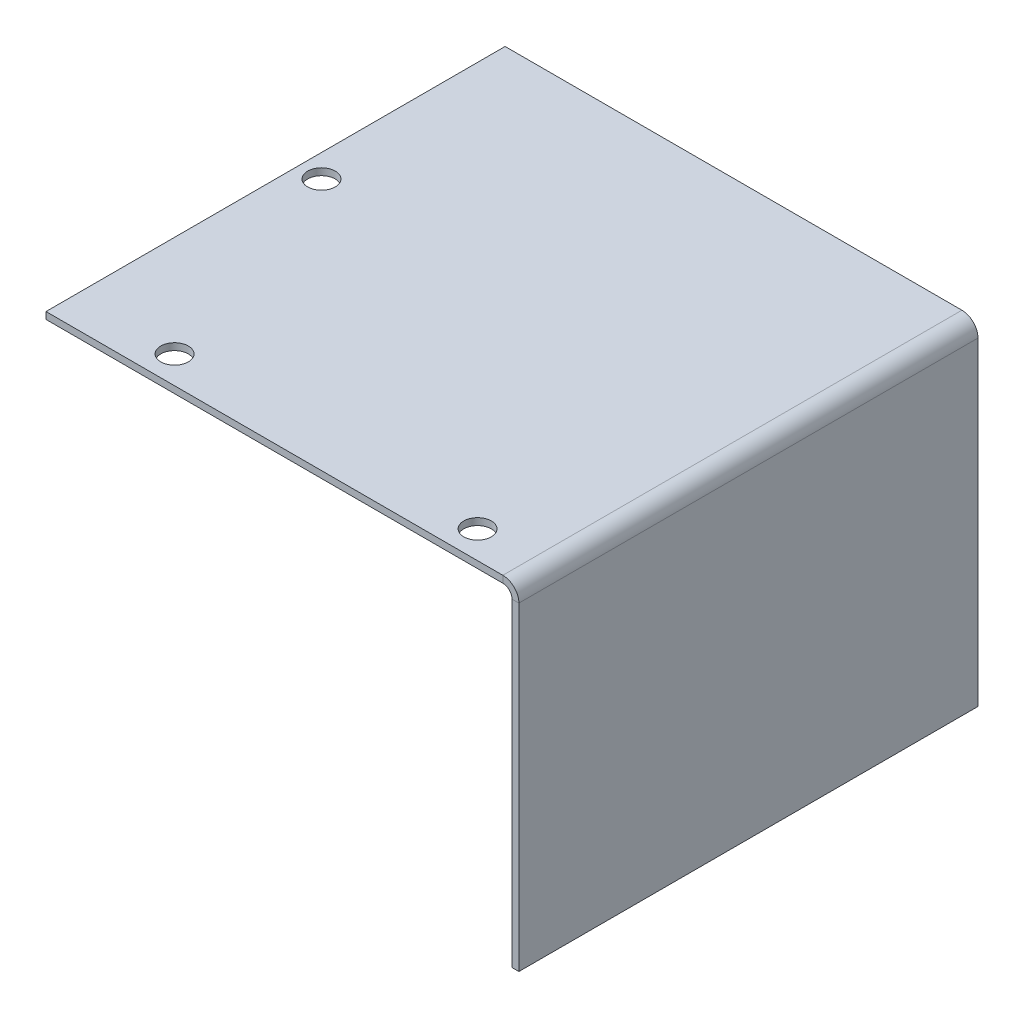
ISO-10303-21;
HEADER;
FILE_DESCRIPTION(('STEP AP214'),'2;1');
FILE_NAME('part.step','',(''),(''),'','','');
FILE_SCHEMA(('AUTOMOTIVE_DESIGN { 1 0 10303 214 1 1 1 1 }'));
ENDSEC;
DATA;
#1=APPLICATION_CONTEXT('core data for automotive mechanical design processes');
#2=APPLICATION_PROTOCOL_DEFINITION('international standard','automotive_design',2000,#1);
#3=PRODUCT_CONTEXT('',#1,'mechanical');
#4=PRODUCT('Part','Part','',(#3));
#5=PRODUCT_RELATED_PRODUCT_CATEGORY('part','',(#4));
#6=PRODUCT_DEFINITION_FORMATION('','',#4);
#7=PRODUCT_DEFINITION_CONTEXT('part definition',#1,'design');
#8=PRODUCT_DEFINITION('design','',#6,#7);
#9=PRODUCT_DEFINITION_SHAPE('','',#8);
#10=(LENGTH_UNIT() NAMED_UNIT(*) SI_UNIT(.MILLI.,.METRE.));
#11=(NAMED_UNIT(*) PLANE_ANGLE_UNIT() SI_UNIT($,.RADIAN.));
#12=(NAMED_UNIT(*) SI_UNIT($,.STERADIAN.) SOLID_ANGLE_UNIT());
#13=UNCERTAINTY_MEASURE_WITH_UNIT(LENGTH_MEASURE(1.E-05),#10,'distance_accuracy_value','');
#14=(GEOMETRIC_REPRESENTATION_CONTEXT(3) GLOBAL_UNCERTAINTY_ASSIGNED_CONTEXT((#13)) GLOBAL_UNIT_ASSIGNED_CONTEXT((#10,
#11,#12)) REPRESENTATION_CONTEXT('',''));
#15=CARTESIAN_POINT('',(0.,0.,0.));
#16=DIRECTION('',(0.,0.,1.));
#17=DIRECTION('',(1.,0.,0.));
#18=AXIS2_PLACEMENT_3D('',#15,#16,#17);
#19=CARTESIAN_POINT('',(103.,-3.5,100.));
#20=DIRECTION('',(0.,0.,1.));
#21=DIRECTION('',(1.,0.,0.));
#22=AXIS2_PLACEMENT_3D('',#19,#20,#21);
#23=PLANE('',#22);
#24=DIRECTION('',(-1.,0.,0.));
#25=VECTOR('',#24,1.);
#26=CARTESIAN_POINT('',(103.,-3.5,100.));
#27=LINE('',#26,#25);
#28=CARTESIAN_POINT('',(103.,-3.5,100.));
#29=VERTEX_POINT('',#28);
#30=CARTESIAN_POINT('',(101.5,-3.5,100.));
#31=VERTEX_POINT('',#30);
#32=EDGE_CURVE('E11',#29,#31,#27,.T.);
#33=ORIENTED_EDGE('',*,*,#32,.F.);
#34=CARTESIAN_POINT('',(99.5,-3.5,100.));
#35=DIRECTION('',(0.,0.,1.));
#36=DIRECTION('',(1.,0.,0.));
#37=AXIS2_PLACEMENT_3D('',#34,#35,#36);
#38=CIRCLE('',#37,3.5);
#39=CARTESIAN_POINT('',(99.5,0.,100.));
#40=VERTEX_POINT('',#39);
#41=EDGE_CURVE('E134',#40,#29,#38,.F.);
#42=ORIENTED_EDGE('',*,*,#41,.F.);
#43=DIRECTION('',(0.,1.,0.));
#44=VECTOR('',#43,1.);
#45=CARTESIAN_POINT('',(99.5,-1.5,100.));
#46=LINE('',#45,#44);
#47=CARTESIAN_POINT('',(99.5,-1.5,100.));
#48=VERTEX_POINT('',#47);
#49=EDGE_CURVE('E44',#48,#40,#46,.T.);
#50=ORIENTED_EDGE('',*,*,#49,.F.);
#51=CARTESIAN_POINT('',(99.5,-3.5,100.));
#52=DIRECTION('',(0.,0.,1.));
#53=DIRECTION('',(1.,0.,0.));
#54=AXIS2_PLACEMENT_3D('',#51,#52,#53);
#55=CIRCLE('',#54,2.);
#56=EDGE_CURVE('E127',#48,#31,#55,.F.);
#57=ORIENTED_EDGE('',*,*,#56,.T.);
#58=EDGE_LOOP('',(#33,#42,#50,#57));
#59=FACE_BOUND('',#58,.T.);
#60=ADVANCED_FACE('F35',(#59),#23,.T.);
#61=CARTESIAN_POINT('',(99.5,-1.5,100.));
#62=DIRECTION('',(0.,0.,1.));
#63=DIRECTION('',(1.,0.,0.));
#64=AXIS2_PLACEMENT_3D('',#61,#62,#63);
#65=PLANE('',#64);
#66=DIRECTION('',(0.,-1.,0.));
#67=VECTOR('',#66,1.);
#68=CARTESIAN_POINT('',(103.,0.,100.));
#69=LINE('',#68,#67);
#70=CARTESIAN_POINT('',(103.,-73.,100.));
#71=VERTEX_POINT('',#70);
#72=EDGE_CURVE('E197',#29,#71,#69,.T.);
#73=ORIENTED_EDGE('',*,*,#72,.F.);
#74=ORIENTED_EDGE('',*,*,#32,.T.);
#75=DIRECTION('',(0.,-1.,0.));
#76=VECTOR('',#75,1.);
#77=CARTESIAN_POINT('',(101.5,0.,100.));
#78=LINE('',#77,#76);
#79=CARTESIAN_POINT('',(101.5,-73.,100.));
#80=VERTEX_POINT('',#79);
#81=EDGE_CURVE('E93',#31,#80,#78,.T.);
#82=ORIENTED_EDGE('',*,*,#81,.T.);
#83=DIRECTION('',(-1.,0.,0.));
#84=VECTOR('',#83,1.);
#85=CARTESIAN_POINT('',(103.,-73.,100.));
#86=LINE('',#85,#84);
#87=EDGE_CURVE('E194',#71,#80,#86,.T.);
#88=ORIENTED_EDGE('',*,*,#87,.F.);
#89=EDGE_LOOP('',(#73,#74,#82,#88));
#90=FACE_BOUND('',#89,.T.);
#91=ADVANCED_FACE('F217',(#90),#65,.T.);
#92=CARTESIAN_POINT('',(99.5,0.,0.));
#93=DIRECTION('',(0.,0.,-1.));
#94=DIRECTION('',(-1.,0.,0.));
#95=AXIS2_PLACEMENT_3D('',#92,#93,#94);
#96=PLANE('',#95);
#97=DIRECTION('',(0.,-1.,0.));
#98=VECTOR('',#97,1.);
#99=CARTESIAN_POINT('',(99.5,0.,0.));
#100=LINE('',#99,#98);
#101=CARTESIAN_POINT('',(99.5,0.,0.));
#102=VERTEX_POINT('',#101);
#103=CARTESIAN_POINT('',(99.5,-1.5,0.));
#104=VERTEX_POINT('',#103);
#105=EDGE_CURVE('E80',#102,#104,#100,.T.);
#106=ORIENTED_EDGE('',*,*,#105,.F.);
#107=CARTESIAN_POINT('',(99.5,-3.5,0.));
#108=DIRECTION('',(0.,0.,1.));
#109=DIRECTION('',(1.,0.,0.));
#110=AXIS2_PLACEMENT_3D('',#107,#108,#109);
#111=CIRCLE('',#110,3.5);
#112=CARTESIAN_POINT('',(103.,-3.5,0.));
#113=VERTEX_POINT('',#112);
#114=EDGE_CURVE('E150',#102,#113,#111,.F.);
#115=ORIENTED_EDGE('',*,*,#114,.T.);
#116=DIRECTION('',(1.,0.,0.));
#117=VECTOR('',#116,1.);
#118=CARTESIAN_POINT('',(101.5,-3.5,0.));
#119=LINE('',#118,#117);
#120=CARTESIAN_POINT('',(101.5,-3.5,0.));
#121=VERTEX_POINT('',#120);
#122=EDGE_CURVE('E87',#121,#113,#119,.T.);
#123=ORIENTED_EDGE('',*,*,#122,.F.);
#124=CARTESIAN_POINT('',(99.5,-3.5,0.));
#125=DIRECTION('',(0.,0.,1.));
#126=DIRECTION('',(1.,0.,0.));
#127=AXIS2_PLACEMENT_3D('',#124,#125,#126);
#128=CIRCLE('',#127,2.);
#129=EDGE_CURVE('E157',#104,#121,#128,.F.);
#130=ORIENTED_EDGE('',*,*,#129,.F.);
#131=EDGE_LOOP('',(#106,#115,#123,#130));
#132=FACE_BOUND('',#131,.T.);
#133=ADVANCED_FACE('F215',(#132),#96,.T.);
#134=CARTESIAN_POINT('',(101.5,-3.5,0.));
#135=DIRECTION('',(0.,0.,-1.));
#136=DIRECTION('',(-1.,0.,0.));
#137=AXIS2_PLACEMENT_3D('',#134,#135,#136);
#138=PLANE('',#137);
#139=DIRECTION('',(1.,0.,0.));
#140=VECTOR('',#139,1.);
#141=CARTESIAN_POINT('',(0.,0.,0.));
#142=LINE('',#141,#140);
#143=CARTESIAN_POINT('',(0.,0.,0.));
#144=VERTEX_POINT('',#143);
#145=EDGE_CURVE('E152',#144,#102,#142,.T.);
#146=ORIENTED_EDGE('',*,*,#145,.T.);
#147=ORIENTED_EDGE('',*,*,#105,.T.);
#148=DIRECTION('',(1.,0.,0.));
#149=VECTOR('',#148,1.);
#150=CARTESIAN_POINT('',(0.,-1.5,0.));
#151=LINE('',#150,#149);
#152=CARTESIAN_POINT('',(0.,-1.5,0.));
#153=VERTEX_POINT('',#152);
#154=EDGE_CURVE('E155',#153,#104,#151,.T.);
#155=ORIENTED_EDGE('',*,*,#154,.F.);
#156=DIRECTION('',(0.,1.,0.));
#157=VECTOR('',#156,1.);
#158=CARTESIAN_POINT('',(0.,-1.5,0.));
#159=LINE('',#158,#157);
#160=EDGE_CURVE('E115',#153,#144,#159,.T.);
#161=ORIENTED_EDGE('',*,*,#160,.T.);
#162=EDGE_LOOP('',(#146,#147,#155,#161));
#163=FACE_BOUND('',#162,.T.);
#164=ADVANCED_FACE('F211',(#163),#138,.T.);
#165=CARTESIAN_POINT('',(101.5,0.,100.));
#166=DIRECTION('',(1.,0.,0.));
#167=DIRECTION('',(0.,1.,0.));
#168=AXIS2_PLACEMENT_3D('',#165,#166,#167);
#169=PLANE('',#168);
#170=DIRECTION('',(0.,-1.,0.));
#171=VECTOR('',#170,1.);
#172=CARTESIAN_POINT('',(101.5,0.,0.));
#173=LINE('',#172,#171);
#174=CARTESIAN_POINT('',(101.5,-73.,0.));
#175=VERTEX_POINT('',#174);
#176=EDGE_CURVE('E140',#121,#175,#173,.T.);
#177=ORIENTED_EDGE('',*,*,#176,.T.);
#178=DIRECTION('',(0.,0.,-1.));
#179=VECTOR('',#178,1.);
#180=CARTESIAN_POINT('',(101.5,-73.,100.));
#181=LINE('',#180,#179);
#182=EDGE_CURVE('E171',#80,#175,#181,.T.);
#183=ORIENTED_EDGE('',*,*,#182,.F.);
#184=ORIENTED_EDGE('',*,*,#81,.F.);
#185=DIRECTION('',(0.,0.,-1.));
#186=VECTOR('',#185,1.);
#187=CARTESIAN_POINT('',(101.5,-3.5,100.));
#188=LINE('',#187,#186);
#189=EDGE_CURVE('E139',#31,#121,#188,.T.);
#190=ORIENTED_EDGE('',*,*,#189,.T.);
#191=EDGE_LOOP('',(#177,#183,#184,#190));
#192=FACE_BOUND('',#191,.T.);
#193=ADVANCED_FACE('F223',(#192),#169,.F.);
#194=CARTESIAN_POINT('',(103.,-73.,100.));
#195=DIRECTION('',(0.,-1.,0.));
#196=DIRECTION('',(0.,0.,-1.));
#197=AXIS2_PLACEMENT_3D('',#194,#195,#196);
#198=PLANE('',#197);
#199=DIRECTION('',(-1.,0.,0.));
#200=VECTOR('',#199,1.);
#201=CARTESIAN_POINT('',(103.,-73.,0.));
#202=LINE('',#201,#200);
#203=CARTESIAN_POINT('',(103.,-73.,0.));
#204=VERTEX_POINT('',#203);
#205=EDGE_CURVE('E143',#204,#175,#202,.T.);
#206=ORIENTED_EDGE('',*,*,#205,.F.);
#207=DIRECTION('',(0.,0.,-1.));
#208=VECTOR('',#207,1.);
#209=CARTESIAN_POINT('',(103.,-73.,100.));
#210=LINE('',#209,#208);
#211=EDGE_CURVE('E169',#71,#204,#210,.T.);
#212=ORIENTED_EDGE('',*,*,#211,.F.);
#213=ORIENTED_EDGE('',*,*,#87,.T.);
#214=ORIENTED_EDGE('',*,*,#182,.T.);
#215=EDGE_LOOP('',(#206,#212,#213,#214));
#216=FACE_BOUND('',#215,.T.);
#217=ADVANCED_FACE('F254',(#216),#198,.T.);
#218=CARTESIAN_POINT('',(103.,0.,100.));
#219=DIRECTION('',(1.,0.,0.));
#220=DIRECTION('',(0.,1.,0.));
#221=AXIS2_PLACEMENT_3D('',#218,#219,#220);
#222=PLANE('',#221);
#223=DIRECTION('',(0.,-1.,0.));
#224=VECTOR('',#223,1.);
#225=CARTESIAN_POINT('',(103.,0.,0.));
#226=LINE('',#225,#224);
#227=EDGE_CURVE('E147',#113,#204,#226,.T.);
#228=ORIENTED_EDGE('',*,*,#227,.F.);
#229=DIRECTION('',(0.,0.,-1.));
#230=VECTOR('',#229,1.);
#231=CARTESIAN_POINT('',(103.,-3.5,100.));
#232=LINE('',#231,#230);
#233=EDGE_CURVE('E166',#29,#113,#232,.T.);
#234=ORIENTED_EDGE('',*,*,#233,.F.);
#235=ORIENTED_EDGE('',*,*,#72,.T.);
#236=ORIENTED_EDGE('',*,*,#211,.T.);
#237=EDGE_LOOP('',(#228,#234,#235,#236));
#238=FACE_BOUND('',#237,.T.);
#239=ADVANCED_FACE('F265',(#238),#222,.T.);
#240=CARTESIAN_POINT('',(99.5,-3.5,100.));
#241=DIRECTION('',(0.,0.,-1.));
#242=DIRECTION('',(-1.,0.,0.));
#243=AXIS2_PLACEMENT_3D('',#240,#241,#242);
#244=CYLINDRICAL_SURFACE('',#243,3.5);
#245=ORIENTED_EDGE('',*,*,#114,.F.);
#246=DIRECTION('',(0.,0.,-1.));
#247=VECTOR('',#246,1.);
#248=CARTESIAN_POINT('',(99.5,0.,100.));
#249=LINE('',#248,#247);
#250=EDGE_CURVE('E163',#40,#102,#249,.T.);
#251=ORIENTED_EDGE('',*,*,#250,.F.);
#252=ORIENTED_EDGE('',*,*,#41,.T.);
#253=ORIENTED_EDGE('',*,*,#233,.T.);
#254=EDGE_LOOP('',(#245,#251,#252,#253));
#255=FACE_BOUND('',#254,.T.);
#256=ADVANCED_FACE('F204',(#255),#244,.T.);
#257=CARTESIAN_POINT('',(0.,0.,100.));
#258=DIRECTION('',(0.,1.,0.));
#259=DIRECTION('',(0.,0.,1.));
#260=AXIS2_PLACEMENT_3D('',#257,#258,#259);
#261=PLANE('',#260);
#262=CARTESIAN_POINT('',(4.99999999999991,0.,45.0000000000002));
#263=DIRECTION('',(0.,1.,0.));
#264=DIRECTION('',(0.,0.,1.));
#265=AXIS2_PLACEMENT_3D('',#262,#263,#264);
#266=CIRCLE('',#265,3.);
#267=CARTESIAN_POINT('',(4.99999999999991,0.,48.0000000000002));
#268=VERTEX_POINT('',#267);
#269=EDGE_CURVE('E190',#268,#268,#266,.T.);
#270=ORIENTED_EDGE('',*,*,#269,.F.);
#271=EDGE_LOOP('',(#270));
#272=FACE_BOUND('',#271,.T.);
#273=CARTESIAN_POINT('',(88.,0.,93.9999999999999));
#274=DIRECTION('',(0.,1.,0.));
#275=DIRECTION('',(0.,0.,1.));
#276=AXIS2_PLACEMENT_3D('',#273,#274,#275);
#277=CIRCLE('',#276,3.00000000000001);
#278=CARTESIAN_POINT('',(88.,0.,96.9999999999999));
#279=VERTEX_POINT('',#278);
#280=EDGE_CURVE('E180',#279,#279,#277,.T.);
#281=ORIENTED_EDGE('',*,*,#280,.F.);
#282=EDGE_LOOP('',(#281));
#283=FACE_BOUND('',#282,.T.);
#284=CARTESIAN_POINT('',(21.9999999999998,0.,93.9999999999999));
#285=DIRECTION('',(0.,1.,0.));
#286=DIRECTION('',(0.,0.,1.));
#287=AXIS2_PLACEMENT_3D('',#284,#285,#286);
#288=CIRCLE('',#287,3.);
#289=CARTESIAN_POINT('',(21.9999999999998,0.,96.9999999999999));
#290=VERTEX_POINT('',#289);
#291=EDGE_CURVE('E177',#290,#290,#288,.T.);
#292=ORIENTED_EDGE('',*,*,#291,.F.);
#293=EDGE_LOOP('',(#292));
#294=FACE_BOUND('',#293,.T.);
#295=ORIENTED_EDGE('',*,*,#145,.F.);
#296=DIRECTION('',(0.,0.,-1.));
#297=VECTOR('',#296,1.);
#298=CARTESIAN_POINT('',(0.,0.,100.));
#299=LINE('',#298,#297);
#300=CARTESIAN_POINT('',(0.,0.,100.));
#301=VERTEX_POINT('',#300);
#302=EDGE_CURVE('E117',#301,#144,#299,.T.);
#303=ORIENTED_EDGE('',*,*,#302,.F.);
#304=DIRECTION('',(1.,0.,0.));
#305=VECTOR('',#304,1.);
#306=CARTESIAN_POINT('',(0.,0.,100.));
#307=LINE('',#306,#305);
#308=EDGE_CURVE('E132',#301,#40,#307,.T.);
#309=ORIENTED_EDGE('',*,*,#308,.T.);
#310=ORIENTED_EDGE('',*,*,#250,.T.);
#311=EDGE_LOOP('',(#295,#303,#309,#310));
#312=FACE_BOUND('',#311,.T.);
#313=ADVANCED_FACE('F210',(#272,#283,#294,#312),#261,.T.);
#314=CARTESIAN_POINT('',(0.,-1.5,100.));
#315=DIRECTION('',(-1.,0.,0.));
#316=DIRECTION('',(0.,0.,1.));
#317=AXIS2_PLACEMENT_3D('',#314,#315,#316);
#318=PLANE('',#317);
#319=ORIENTED_EDGE('',*,*,#160,.F.);
#320=DIRECTION('',(0.,0.,-1.));
#321=VECTOR('',#320,1.);
#322=CARTESIAN_POINT('',(0.,-1.5,100.));
#323=LINE('',#322,#321);
#324=CARTESIAN_POINT('',(0.,-1.5,100.));
#325=VERTEX_POINT('',#324);
#326=EDGE_CURVE('E109',#325,#153,#323,.T.);
#327=ORIENTED_EDGE('',*,*,#326,.F.);
#328=DIRECTION('',(0.,1.,0.));
#329=VECTOR('',#328,1.);
#330=CARTESIAN_POINT('',(0.,-1.5,100.));
#331=LINE('',#330,#329);
#332=EDGE_CURVE('E113',#325,#301,#331,.T.);
#333=ORIENTED_EDGE('',*,*,#332,.T.);
#334=ORIENTED_EDGE('',*,*,#302,.T.);
#335=EDGE_LOOP('',(#319,#327,#333,#334));
#336=FACE_BOUND('',#335,.T.);
#337=ADVANCED_FACE('F111',(#336),#318,.T.);
#338=CARTESIAN_POINT('',(0.,-1.5,100.));
#339=DIRECTION('',(0.,1.,0.));
#340=DIRECTION('',(0.,0.,1.));
#341=AXIS2_PLACEMENT_3D('',#338,#339,#340);
#342=PLANE('',#341);
#343=CARTESIAN_POINT('',(4.99999999999991,-1.5,45.0000000000002));
#344=DIRECTION('',(0.,1.,0.));
#345=DIRECTION('',(0.,0.,1.));
#346=AXIS2_PLACEMENT_3D('',#343,#344,#345);
#347=CIRCLE('',#346,3.);
#348=CARTESIAN_POINT('',(4.99999999999991,-1.5,48.0000000000002));
#349=VERTEX_POINT('',#348);
#350=EDGE_CURVE('E38',#349,#349,#347,.T.);
#351=ORIENTED_EDGE('',*,*,#350,.T.);
#352=EDGE_LOOP('',(#351));
#353=FACE_BOUND('',#352,.T.);
#354=CARTESIAN_POINT('',(88.,-1.5,93.9999999999999));
#355=DIRECTION('',(0.,1.,0.));
#356=DIRECTION('',(0.,0.,1.));
#357=AXIS2_PLACEMENT_3D('',#354,#355,#356);
#358=CIRCLE('',#357,3.00000000000001);
#359=CARTESIAN_POINT('',(88.,-1.5,96.9999999999999));
#360=VERTEX_POINT('',#359);
#361=EDGE_CURVE('E178',#360,#360,#358,.T.);
#362=ORIENTED_EDGE('',*,*,#361,.T.);
#363=EDGE_LOOP('',(#362));
#364=FACE_BOUND('',#363,.T.);
#365=CARTESIAN_POINT('',(21.9999999999998,-1.5,93.9999999999999));
#366=DIRECTION('',(0.,1.,0.));
#367=DIRECTION('',(0.,0.,1.));
#368=AXIS2_PLACEMENT_3D('',#365,#366,#367);
#369=CIRCLE('',#368,3.);
#370=CARTESIAN_POINT('',(21.9999999999998,-1.5,96.9999999999999));
#371=VERTEX_POINT('',#370);
#372=EDGE_CURVE('E144',#371,#371,#369,.T.);
#373=ORIENTED_EDGE('',*,*,#372,.T.);
#374=EDGE_LOOP('',(#373));
#375=FACE_BOUND('',#374,.T.);
#376=ORIENTED_EDGE('',*,*,#154,.T.);
#377=DIRECTION('',(0.,0.,-1.));
#378=VECTOR('',#377,1.);
#379=CARTESIAN_POINT('',(99.5,-1.5,100.));
#380=LINE('',#379,#378);
#381=EDGE_CURVE('E118',#48,#104,#380,.T.);
#382=ORIENTED_EDGE('',*,*,#381,.F.);
#383=DIRECTION('',(1.,0.,0.));
#384=VECTOR('',#383,1.);
#385=CARTESIAN_POINT('',(0.,-1.5,100.));
#386=LINE('',#385,#384);
#387=EDGE_CURVE('E122',#325,#48,#386,.T.);
#388=ORIENTED_EDGE('',*,*,#387,.F.);
#389=ORIENTED_EDGE('',*,*,#326,.T.);
#390=EDGE_LOOP('',(#376,#382,#388,#389));
#391=FACE_BOUND('',#390,.T.);
#392=ADVANCED_FACE('F123',(#353,#364,#375,#391),#342,.F.);
#393=CARTESIAN_POINT('',(99.5,-3.5,100.));
#394=DIRECTION('',(0.,0.,-1.));
#395=DIRECTION('',(-1.,0.,0.));
#396=AXIS2_PLACEMENT_3D('',#393,#394,#395);
#397=CYLINDRICAL_SURFACE('',#396,2.);
#398=ORIENTED_EDGE('',*,*,#129,.T.);
#399=ORIENTED_EDGE('',*,*,#189,.F.);
#400=ORIENTED_EDGE('',*,*,#56,.F.);
#401=ORIENTED_EDGE('',*,*,#381,.T.);
#402=EDGE_LOOP('',(#398,#399,#400,#401));
#403=FACE_BOUND('',#402,.T.);
#404=ADVANCED_FACE('F213',(#403),#397,.F.);
#405=CARTESIAN_POINT('',(99.5,-3.5,100.));
#406=DIRECTION('',(0.,0.,1.));
#407=DIRECTION('',(1.,0.,0.));
#408=AXIS2_PLACEMENT_3D('',#405,#406,#407);
#409=PLANE('',#408);
#410=ORIENTED_EDGE('',*,*,#387,.T.);
#411=ORIENTED_EDGE('',*,*,#49,.T.);
#412=ORIENTED_EDGE('',*,*,#308,.F.);
#413=ORIENTED_EDGE('',*,*,#332,.F.);
#414=EDGE_LOOP('',(#410,#411,#412,#413));
#415=FACE_BOUND('',#414,.T.);
#416=ADVANCED_FACE('F130',(#415),#409,.T.);
#417=CARTESIAN_POINT('',(99.5,-3.5,0.));
#418=DIRECTION('',(0.,0.,1.));
#419=DIRECTION('',(1.,0.,0.));
#420=AXIS2_PLACEMENT_3D('',#417,#418,#419);
#421=PLANE('',#420);
#422=ORIENTED_EDGE('',*,*,#176,.F.);
#423=ORIENTED_EDGE('',*,*,#122,.T.);
#424=ORIENTED_EDGE('',*,*,#227,.T.);
#425=ORIENTED_EDGE('',*,*,#205,.T.);
#426=EDGE_LOOP('',(#422,#423,#424,#425));
#427=FACE_BOUND('',#426,.T.);
#428=ADVANCED_FACE('F317',(#427),#421,.F.);
#429=CARTESIAN_POINT('',(21.9999999999998,-10.,93.9999999999999));
#430=DIRECTION('',(0.,1.,0.));
#431=DIRECTION('',(0.,0.,1.));
#432=AXIS2_PLACEMENT_3D('',#429,#430,#431);
#433=CYLINDRICAL_SURFACE('',#432,3.);
#434=ORIENTED_EDGE('',*,*,#291,.T.);
#435=EDGE_LOOP('',(#434));
#436=FACE_BOUND('',#435,.T.);
#437=ORIENTED_EDGE('',*,*,#372,.F.);
#438=EDGE_LOOP('',(#437));
#439=FACE_BOUND('',#438,.T.);
#440=ADVANCED_FACE('F327',(#436,#439),#433,.F.);
#441=CARTESIAN_POINT('',(88.,-10.,93.9999999999999));
#442=DIRECTION('',(0.,1.,0.));
#443=DIRECTION('',(0.,0.,1.));
#444=AXIS2_PLACEMENT_3D('',#441,#442,#443);
#445=CYLINDRICAL_SURFACE('',#444,3.00000000000001);
#446=ORIENTED_EDGE('',*,*,#280,.T.);
#447=EDGE_LOOP('',(#446));
#448=FACE_BOUND('',#447,.T.);
#449=ORIENTED_EDGE('',*,*,#361,.F.);
#450=EDGE_LOOP('',(#449));
#451=FACE_BOUND('',#450,.T.);
#452=ADVANCED_FACE('F354',(#448,#451),#445,.F.);
#453=CARTESIAN_POINT('',(4.99999999999991,-10.,45.0000000000002));
#454=DIRECTION('',(0.,1.,0.));
#455=DIRECTION('',(0.,0.,1.));
#456=AXIS2_PLACEMENT_3D('',#453,#454,#455);
#457=CYLINDRICAL_SURFACE('',#456,3.);
#458=ORIENTED_EDGE('',*,*,#269,.T.);
#459=EDGE_LOOP('',(#458));
#460=FACE_BOUND('',#459,.T.);
#461=ORIENTED_EDGE('',*,*,#350,.F.);
#462=EDGE_LOOP('',(#461));
#463=FACE_BOUND('',#462,.T.);
#464=ADVANCED_FACE('F365',(#460,#463),#457,.F.);
#465=CLOSED_SHELL('',(#60,#91,#133,#164,#193,#217,#239,#256,#313,#337,#392,#404,#416,#428,#440,
#452,#464));
#466=MANIFOLD_SOLID_BREP('B2',#465);
#467=ADVANCED_BREP_SHAPE_REPRESENTATION('',(#18,#466),#14);
#468=SHAPE_DEFINITION_REPRESENTATION(#9,#467);
ENDSEC;
END-ISO-10303-21;
